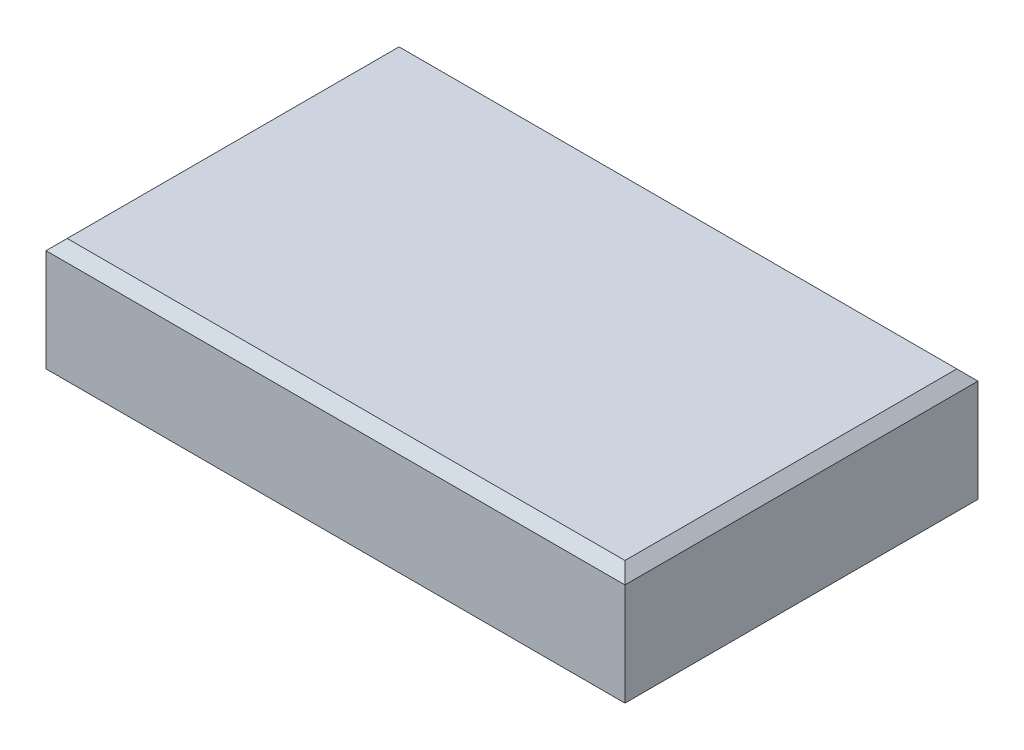
ISO-10303-21;
HEADER;
FILE_DESCRIPTION(('STEP AP214'),'2;1');
FILE_NAME('part.step','',(''),(''),'','','');
FILE_SCHEMA(('AUTOMOTIVE_DESIGN { 1 0 10303 214 1 1 1 1 }'));
ENDSEC;
DATA;
#1=APPLICATION_CONTEXT('core data for automotive mechanical design processes');
#2=APPLICATION_PROTOCOL_DEFINITION('international standard','automotive_design',2000,#1);
#3=PRODUCT_CONTEXT('',#1,'mechanical');
#4=PRODUCT('Part','Part','',(#3));
#5=PRODUCT_RELATED_PRODUCT_CATEGORY('part','',(#4));
#6=PRODUCT_DEFINITION_FORMATION('','',#4);
#7=PRODUCT_DEFINITION_CONTEXT('part definition',#1,'design');
#8=PRODUCT_DEFINITION('design','',#6,#7);
#9=PRODUCT_DEFINITION_SHAPE('','',#8);
#10=(LENGTH_UNIT() NAMED_UNIT(*) SI_UNIT(.MILLI.,.METRE.));
#11=(NAMED_UNIT(*) PLANE_ANGLE_UNIT() SI_UNIT($,.RADIAN.));
#12=(NAMED_UNIT(*) SI_UNIT($,.STERADIAN.) SOLID_ANGLE_UNIT());
#13=UNCERTAINTY_MEASURE_WITH_UNIT(LENGTH_MEASURE(1.E-05),#10,'distance_accuracy_value','');
#14=(GEOMETRIC_REPRESENTATION_CONTEXT(3) GLOBAL_UNCERTAINTY_ASSIGNED_CONTEXT((#13)) GLOBAL_UNIT_ASSIGNED_CONTEXT((#10,
#11,#12)) REPRESENTATION_CONTEXT('',''));
#15=CARTESIAN_POINT('',(0.,0.,0.));
#16=DIRECTION('',(0.,0.,1.));
#17=DIRECTION('',(1.,0.,0.));
#18=AXIS2_PLACEMENT_3D('',#15,#16,#17);
#19=CARTESIAN_POINT('',(41.,8.,25.));
#20=DIRECTION('',(-1.,0.,0.));
#21=DIRECTION('',(0.,0.,1.));
#22=AXIS2_PLACEMENT_3D('',#19,#20,#21);
#23=PLANE('',#22);
#24=DIRECTION('',(0.,-1.,0.));
#25=VECTOR('',#24,1.);
#26=CARTESIAN_POINT('',(41.,8.,-25.));
#27=LINE('',#26,#25);
#28=CARTESIAN_POINT('',(41.,6.5,-25.));
#29=VERTEX_POINT('',#28);
#30=CARTESIAN_POINT('',(41.,-8.,-25.));
#31=VERTEX_POINT('',#30);
#32=EDGE_CURVE('E93',#29,#31,#27,.T.);
#33=ORIENTED_EDGE('',*,*,#32,.F.);
#34=DIRECTION('',(0.,0.,1.));
#35=VECTOR('',#34,1.);
#36=CARTESIAN_POINT('',(41.,6.5,25.));
#37=LINE('',#36,#35);
#38=CARTESIAN_POINT('',(41.,6.5,25.));
#39=VERTEX_POINT('',#38);
#40=EDGE_CURVE('E136',#29,#39,#37,.T.);
#41=ORIENTED_EDGE('',*,*,#40,.T.);
#42=DIRECTION('',(0.,-1.,0.));
#43=VECTOR('',#42,1.);
#44=CARTESIAN_POINT('',(41.,8.,25.));
#45=LINE('',#44,#43);
#46=CARTESIAN_POINT('',(41.,-8.,25.));
#47=VERTEX_POINT('',#46);
#48=EDGE_CURVE('E115',#39,#47,#45,.T.);
#49=ORIENTED_EDGE('',*,*,#48,.T.);
#50=DIRECTION('',(0.,0.,-1.));
#51=VECTOR('',#50,1.);
#52=CARTESIAN_POINT('',(41.,-8.,25.));
#53=LINE('',#52,#51);
#54=EDGE_CURVE('E111',#47,#31,#53,.T.);
#55=ORIENTED_EDGE('',*,*,#54,.T.);
#56=EDGE_LOOP('',(#33,#41,#49,#55));
#57=FACE_BOUND('',#56,.T.);
#58=ADVANCED_FACE('F39',(#57),#23,.F.);
#59=CARTESIAN_POINT('',(-41.,8.,-25.));
#60=DIRECTION('',(0.,0.,1.));
#61=DIRECTION('',(1.,0.,0.));
#62=AXIS2_PLACEMENT_3D('',#59,#60,#61);
#63=PLANE('',#62);
#64=DIRECTION('',(0.,-1.,0.));
#65=VECTOR('',#64,1.);
#66=CARTESIAN_POINT('',(-41.,8.,-25.));
#67=LINE('',#66,#65);
#68=CARTESIAN_POINT('',(-41.,6.5,-25.));
#69=VERTEX_POINT('',#68);
#70=CARTESIAN_POINT('',(-41.,-8.,-25.));
#71=VERTEX_POINT('',#70);
#72=EDGE_CURVE('E105',#69,#71,#67,.T.);
#73=ORIENTED_EDGE('',*,*,#72,.F.);
#74=DIRECTION('',(1.,0.,0.));
#75=VECTOR('',#74,1.);
#76=CARTESIAN_POINT('',(-41.,6.5,-25.));
#77=LINE('',#76,#75);
#78=EDGE_CURVE('E99',#69,#29,#77,.T.);
#79=ORIENTED_EDGE('',*,*,#78,.T.);
#80=ORIENTED_EDGE('',*,*,#32,.T.);
#81=DIRECTION('',(-1.,0.,0.));
#82=VECTOR('',#81,1.);
#83=CARTESIAN_POINT('',(-41.,-8.,-25.));
#84=LINE('',#83,#82);
#85=EDGE_CURVE('E96',#31,#71,#84,.T.);
#86=ORIENTED_EDGE('',*,*,#85,.T.);
#87=EDGE_LOOP('',(#73,#79,#80,#86));
#88=FACE_BOUND('',#87,.T.);
#89=ADVANCED_FACE('F95',(#88),#63,.F.);
#90=CARTESIAN_POINT('',(-41.,8.,25.));
#91=DIRECTION('',(1.,0.,0.));
#92=DIRECTION('',(0.,0.,-1.));
#93=AXIS2_PLACEMENT_3D('',#90,#91,#92);
#94=PLANE('',#93);
#95=DIRECTION('',(0.,-1.,0.));
#96=VECTOR('',#95,1.);
#97=CARTESIAN_POINT('',(-41.,8.,25.));
#98=LINE('',#97,#96);
#99=CARTESIAN_POINT('',(-41.,6.5,25.));
#100=VERTEX_POINT('',#99);
#101=CARTESIAN_POINT('',(-41.,-8.,25.));
#102=VERTEX_POINT('',#101);
#103=EDGE_CURVE('E125',#100,#102,#98,.T.);
#104=ORIENTED_EDGE('',*,*,#103,.F.);
#105=DIRECTION('',(0.,0.,-1.));
#106=VECTOR('',#105,1.);
#107=CARTESIAN_POINT('',(-41.,6.5,25.));
#108=LINE('',#107,#106);
#109=EDGE_CURVE('E49',#100,#69,#108,.T.);
#110=ORIENTED_EDGE('',*,*,#109,.T.);
#111=ORIENTED_EDGE('',*,*,#72,.T.);
#112=DIRECTION('',(0.,0.,1.));
#113=VECTOR('',#112,1.);
#114=CARTESIAN_POINT('',(-41.,-8.,25.));
#115=LINE('',#114,#113);
#116=EDGE_CURVE('E113',#71,#102,#115,.T.);
#117=ORIENTED_EDGE('',*,*,#116,.T.);
#118=EDGE_LOOP('',(#104,#110,#111,#117));
#119=FACE_BOUND('',#118,.T.);
#120=ADVANCED_FACE('F160',(#119),#94,.F.);
#121=CARTESIAN_POINT('',(-41.,8.,25.));
#122=DIRECTION('',(0.,0.,-1.));
#123=DIRECTION('',(-1.,0.,0.));
#124=AXIS2_PLACEMENT_3D('',#121,#122,#123);
#125=PLANE('',#124);
#126=ORIENTED_EDGE('',*,*,#48,.F.);
#127=DIRECTION('',(-1.,0.,0.));
#128=VECTOR('',#127,1.);
#129=CARTESIAN_POINT('',(-41.,6.5,25.));
#130=LINE('',#129,#128);
#131=EDGE_CURVE('E11',#39,#100,#130,.T.);
#132=ORIENTED_EDGE('',*,*,#131,.T.);
#133=ORIENTED_EDGE('',*,*,#103,.T.);
#134=DIRECTION('',(1.,0.,0.));
#135=VECTOR('',#134,1.);
#136=CARTESIAN_POINT('',(-41.,-8.,25.));
#137=LINE('',#136,#135);
#138=EDGE_CURVE('E122',#102,#47,#137,.T.);
#139=ORIENTED_EDGE('',*,*,#138,.T.);
#140=EDGE_LOOP('',(#126,#132,#133,#139));
#141=FACE_BOUND('',#140,.T.);
#142=ADVANCED_FACE('F159',(#141),#125,.F.);
#143=CARTESIAN_POINT('',(0.,8.,0.));
#144=DIRECTION('',(0.,-1.,0.));
#145=DIRECTION('',(0.,0.,-1.));
#146=AXIS2_PLACEMENT_3D('',#143,#144,#145);
#147=PLANE('',#146);
#148=DIRECTION('',(1.,0.,0.));
#149=VECTOR('',#148,1.);
#150=CARTESIAN_POINT('',(0.,8.,23.5));
#151=LINE('',#150,#149);
#152=CARTESIAN_POINT('',(-39.5,8.,23.5));
#153=VERTEX_POINT('',#152);
#154=CARTESIAN_POINT('',(39.5,8.,23.5));
#155=VERTEX_POINT('',#154);
#156=EDGE_CURVE('E104',#153,#155,#151,.T.);
#157=ORIENTED_EDGE('',*,*,#156,.T.);
#158=DIRECTION('',(0.,0.,-1.));
#159=VECTOR('',#158,1.);
#160=CARTESIAN_POINT('',(39.5,8.,0.));
#161=LINE('',#160,#159);
#162=CARTESIAN_POINT('',(39.5,8.,-23.5));
#163=VERTEX_POINT('',#162);
#164=EDGE_CURVE('E133',#155,#163,#161,.T.);
#165=ORIENTED_EDGE('',*,*,#164,.T.);
#166=DIRECTION('',(-1.,0.,0.));
#167=VECTOR('',#166,1.);
#168=CARTESIAN_POINT('',(0.,8.,-23.5));
#169=LINE('',#168,#167);
#170=CARTESIAN_POINT('',(-39.5,8.,-23.5));
#171=VERTEX_POINT('',#170);
#172=EDGE_CURVE('E131',#163,#171,#169,.T.);
#173=ORIENTED_EDGE('',*,*,#172,.T.);
#174=DIRECTION('',(0.,0.,1.));
#175=VECTOR('',#174,1.);
#176=CARTESIAN_POINT('',(-39.5,8.,0.));
#177=LINE('',#176,#175);
#178=EDGE_CURVE('E129',#171,#153,#177,.T.);
#179=ORIENTED_EDGE('',*,*,#178,.T.);
#180=EDGE_LOOP('',(#157,#165,#173,#179));
#181=FACE_BOUND('',#180,.T.);
#182=ADVANCED_FACE('F154',(#181),#147,.F.);
#183=CARTESIAN_POINT('',(0.,-8.,0.));
#184=DIRECTION('',(0.,-1.,0.));
#185=DIRECTION('',(0.,0.,-1.));
#186=AXIS2_PLACEMENT_3D('',#183,#184,#185);
#187=PLANE('',#186);
#188=ORIENTED_EDGE('',*,*,#54,.F.);
#189=ORIENTED_EDGE('',*,*,#138,.F.);
#190=ORIENTED_EDGE('',*,*,#116,.F.);
#191=ORIENTED_EDGE('',*,*,#85,.F.);
#192=EDGE_LOOP('',(#188,#189,#190,#191));
#193=FACE_BOUND('',#192,.T.);
#194=ADVANCED_FACE('F109',(#193),#187,.T.);
#195=CARTESIAN_POINT('',(-39.5,8.,0.));
#196=DIRECTION('',(0.707106781186551,-0.707106781186544,0.));
#197=DIRECTION('',(0.,0.,1.));
#198=AXIS2_PLACEMENT_3D('',#195,#196,#197);
#199=PLANE('',#198);
#200=DIRECTION('',(-0.577350269189625,-0.57735026918963,-0.577350269189623));
#201=VECTOR('',#200,1.);
#202=CARTESIAN_POINT('',(-31.6666666666667,15.8333333333334,-15.6666666666668));
#203=LINE('',#202,#201);
#204=EDGE_CURVE('E119',#69,#171,#203,.F.);
#205=ORIENTED_EDGE('',*,*,#204,.F.);
#206=ORIENTED_EDGE('',*,*,#109,.F.);
#207=DIRECTION('',(-0.577350269189624,-0.577350269189629,0.577350269189624));
#208=VECTOR('',#207,1.);
#209=CARTESIAN_POINT('',(-26.3333333333334,21.1666666666667,10.3333333333334));
#210=LINE('',#209,#208);
#211=EDGE_CURVE('E44',#153,#100,#210,.T.);
#212=ORIENTED_EDGE('',*,*,#211,.F.);
#213=ORIENTED_EDGE('',*,*,#178,.F.);
#214=EDGE_LOOP('',(#205,#206,#212,#213));
#215=FACE_BOUND('',#214,.T.);
#216=ADVANCED_FACE('F42',(#215),#199,.F.);
#217=CARTESIAN_POINT('',(0.,8.,23.5));
#218=DIRECTION('',(0.,-0.707106781186544,-0.707106781186551));
#219=DIRECTION('',(1.,0.,0.));
#220=AXIS2_PLACEMENT_3D('',#217,#218,#219);
#221=PLANE('',#220);
#222=ORIENTED_EDGE('',*,*,#211,.T.);
#223=ORIENTED_EDGE('',*,*,#131,.F.);
#224=DIRECTION('',(-0.577350269189625,0.577350269189629,-0.577350269189624));
#225=VECTOR('',#224,1.);
#226=CARTESIAN_POINT('',(26.3333333333334,21.1666666666667,10.3333333333334));
#227=LINE('',#226,#225);
#228=EDGE_CURVE('E142',#155,#39,#227,.F.);
#229=ORIENTED_EDGE('',*,*,#228,.F.);
#230=ORIENTED_EDGE('',*,*,#156,.F.);
#231=EDGE_LOOP('',(#222,#223,#229,#230));
#232=FACE_BOUND('',#231,.T.);
#233=ADVANCED_FACE('F184',(#232),#221,.F.);
#234=CARTESIAN_POINT('',(0.,8.,-23.5));
#235=DIRECTION('',(0.,-0.707106781186543,0.707106781186552));
#236=DIRECTION('',(-1.,0.,0.));
#237=AXIS2_PLACEMENT_3D('',#234,#235,#236);
#238=PLANE('',#237);
#239=ORIENTED_EDGE('',*,*,#204,.T.);
#240=ORIENTED_EDGE('',*,*,#172,.F.);
#241=DIRECTION('',(0.577350269189626,-0.57735026918963,-0.577350269189622));
#242=VECTOR('',#241,1.);
#243=CARTESIAN_POINT('',(26.3333333333333,21.1666666666667,-10.3333333333334));
#244=LINE('',#243,#242);
#245=EDGE_CURVE('E140',#29,#163,#244,.F.);
#246=ORIENTED_EDGE('',*,*,#245,.F.);
#247=ORIENTED_EDGE('',*,*,#78,.F.);
#248=EDGE_LOOP('',(#239,#240,#246,#247));
#249=FACE_BOUND('',#248,.T.);
#250=ADVANCED_FACE('F147',(#249),#238,.F.);
#251=CARTESIAN_POINT('',(39.5,8.,0.));
#252=DIRECTION('',(-0.70710678118655,-0.707106781186545,0.));
#253=DIRECTION('',(0.,0.,-1.));
#254=AXIS2_PLACEMENT_3D('',#251,#252,#253);
#255=PLANE('',#254);
#256=ORIENTED_EDGE('',*,*,#228,.T.);
#257=ORIENTED_EDGE('',*,*,#40,.F.);
#258=ORIENTED_EDGE('',*,*,#245,.T.);
#259=ORIENTED_EDGE('',*,*,#164,.F.);
#260=EDGE_LOOP('',(#256,#257,#258,#259));
#261=FACE_BOUND('',#260,.T.);
#262=ADVANCED_FACE('F158',(#261),#255,.F.);
#263=CLOSED_SHELL('',(#58,#89,#120,#142,#182,#194,#216,#233,#250,#262));
#264=MANIFOLD_SOLID_BREP('B2',#263);
#265=ADVANCED_BREP_SHAPE_REPRESENTATION('',(#18,#264),#14);
#266=SHAPE_DEFINITION_REPRESENTATION(#9,#265);
ENDSEC;
END-ISO-10303-21;
